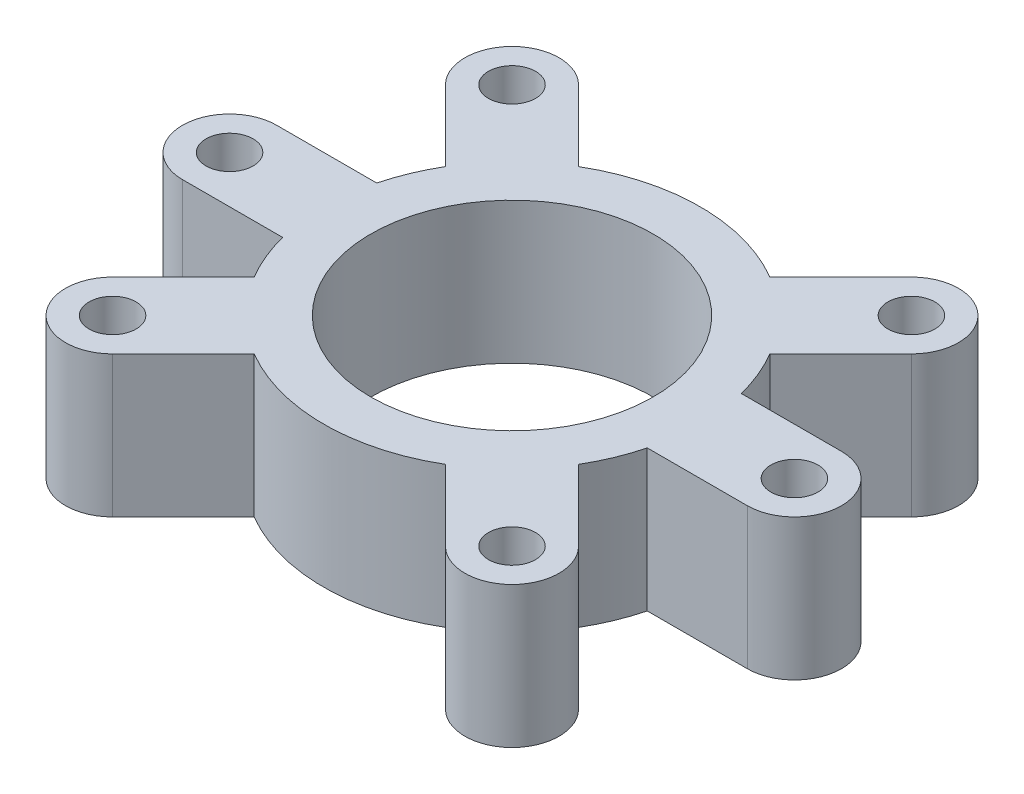
ISO-10303-21;
HEADER;
FILE_DESCRIPTION(('STEP AP214'),'2;1');
FILE_NAME('part.step','',(''),(''),'','','');
FILE_SCHEMA(('AUTOMOTIVE_DESIGN { 1 0 10303 214 1 1 1 1 }'));
ENDSEC;
DATA;
#1=APPLICATION_CONTEXT('core data for automotive mechanical design processes');
#2=APPLICATION_PROTOCOL_DEFINITION('international standard','automotive_design',2000,#1);
#3=PRODUCT_CONTEXT('',#1,'mechanical');
#4=PRODUCT('Part','Part','',(#3));
#5=PRODUCT_RELATED_PRODUCT_CATEGORY('part','',(#4));
#6=PRODUCT_DEFINITION_FORMATION('','',#4);
#7=PRODUCT_DEFINITION_CONTEXT('part definition',#1,'design');
#8=PRODUCT_DEFINITION('design','',#6,#7);
#9=PRODUCT_DEFINITION_SHAPE('','',#8);
#10=(LENGTH_UNIT() NAMED_UNIT(*) SI_UNIT(.MILLI.,.METRE.));
#11=(NAMED_UNIT(*) PLANE_ANGLE_UNIT() SI_UNIT($,.RADIAN.));
#12=(NAMED_UNIT(*) SI_UNIT($,.STERADIAN.) SOLID_ANGLE_UNIT());
#13=UNCERTAINTY_MEASURE_WITH_UNIT(LENGTH_MEASURE(1.E-05),#10,'distance_accuracy_value','');
#14=(GEOMETRIC_REPRESENTATION_CONTEXT(3) GLOBAL_UNCERTAINTY_ASSIGNED_CONTEXT((#13)) GLOBAL_UNIT_ASSIGNED_CONTEXT((#10,
#11,#12)) REPRESENTATION_CONTEXT('',''));
#15=CARTESIAN_POINT('',(0.,0.,0.));
#16=DIRECTION('',(0.,0.,1.));
#17=DIRECTION('',(1.,0.,0.));
#18=AXIS2_PLACEMENT_3D('',#15,#16,#17);
#19=CARTESIAN_POINT('',(0.,15.,0.));
#20=DIRECTION('',(0.,1.,0.));
#21=DIRECTION('',(0.,0.,1.));
#22=AXIS2_PLACEMENT_3D('',#19,#20,#21);
#23=PLANE('',#22);
#24=CARTESIAN_POINT('',(-42.4264068711925,15.,-42.4264068711932));
#25=DIRECTION('',(0.,1.,0.));
#26=DIRECTION('',(0.,0.,1.));
#27=AXIS2_PLACEMENT_3D('',#24,#25,#26);
#28=CIRCLE('',#27,5.);
#29=CARTESIAN_POINT('',(-42.4264068711925,15.,-37.4264068711932));
#30=VERTEX_POINT('',#29);
#31=EDGE_CURVE('E459',#30,#30,#28,.T.);
#32=ORIENTED_EDGE('',*,*,#31,.F.);
#33=EDGE_LOOP('',(#32));
#34=FACE_BOUND('',#33,.T.);
#35=CARTESIAN_POINT('',(-42.4264068711931,15.,42.4264068711926));
#36=DIRECTION('',(0.,1.,0.));
#37=DIRECTION('',(0.,0.,1.));
#38=AXIS2_PLACEMENT_3D('',#35,#36,#37);
#39=CIRCLE('',#38,5.00000000000001);
#40=CARTESIAN_POINT('',(-42.4264068711931,15.,47.4264068711926));
#41=VERTEX_POINT('',#40);
#42=EDGE_CURVE('E471',#41,#41,#39,.T.);
#43=ORIENTED_EDGE('',*,*,#42,.F.);
#44=EDGE_LOOP('',(#43));
#45=FACE_BOUND('',#44,.T.);
#46=CARTESIAN_POINT('',(60.,15.,0.));
#47=DIRECTION('',(0.,1.,0.));
#48=DIRECTION('',(0.,0.,1.));
#49=AXIS2_PLACEMENT_3D('',#46,#47,#48);
#50=CIRCLE('',#49,5.);
#51=CARTESIAN_POINT('',(60.,15.,5.));
#52=VERTEX_POINT('',#51);
#53=EDGE_CURVE('E483',#52,#52,#50,.T.);
#54=ORIENTED_EDGE('',*,*,#53,.F.);
#55=EDGE_LOOP('',(#54));
#56=FACE_BOUND('',#55,.T.);
#57=CARTESIAN_POINT('',(0.,15.,0.));
#58=DIRECTION('',(0.,1.,0.));
#59=DIRECTION('',(0.,0.,1.));
#60=AXIS2_PLACEMENT_3D('',#57,#58,#59);
#61=CIRCLE('',#60,40.);
#62=CARTESIAN_POINT('',(34.4571956871238,15.,20.3150600633929));
#63=VERTEX_POINT('',#62);
#64=CARTESIAN_POINT('',(38.7298334620742,15.,10.));
#65=VERTEX_POINT('',#64);
#66=EDGE_CURVE('E273',#63,#65,#61,.T.);
#67=ORIENTED_EDGE('',*,*,#66,.T.);
#68=DIRECTION('',(1.,0.,0.));
#69=VECTOR('',#68,1.);
#70=CARTESIAN_POINT('',(60.,15.,10.));
#71=LINE('',#70,#69);
#72=CARTESIAN_POINT('',(60.,15.,10.));
#73=VERTEX_POINT('',#72);
#74=EDGE_CURVE('E141',#65,#73,#71,.T.);
#75=ORIENTED_EDGE('',*,*,#74,.T.);
#76=CARTESIAN_POINT('',(60.,15.,0.));
#77=DIRECTION('',(0.,1.,0.));
#78=DIRECTION('',(0.,0.,-1.));
#79=AXIS2_PLACEMENT_3D('',#76,#77,#78);
#80=CIRCLE('',#79,10.);
#81=CARTESIAN_POINT('',(60.,15.,-10.));
#82=VERTEX_POINT('',#81);
#83=EDGE_CURVE('E336',#73,#82,#80,.T.);
#84=ORIENTED_EDGE('',*,*,#83,.T.);
#85=DIRECTION('',(-1.,0.,0.));
#86=VECTOR('',#85,1.);
#87=CARTESIAN_POINT('',(38.7298334620742,15.,-10.));
#88=LINE('',#87,#86);
#89=CARTESIAN_POINT('',(38.7298334620742,15.,-10.));
#90=VERTEX_POINT('',#89);
#91=EDGE_CURVE('E355',#82,#90,#88,.T.);
#92=ORIENTED_EDGE('',*,*,#91,.T.);
#93=CARTESIAN_POINT('',(0.,15.,0.));
#94=DIRECTION('',(0.,1.,0.));
#95=DIRECTION('',(0.,0.,1.));
#96=AXIS2_PLACEMENT_3D('',#93,#94,#95);
#97=CIRCLE('',#96,40.);
#98=CARTESIAN_POINT('',(34.457195687124,15.,-20.3150600633924));
#99=VERTEX_POINT('',#98);
#100=EDGE_CURVE('E352',#90,#99,#97,.T.);
#101=ORIENTED_EDGE('',*,*,#100,.T.);
#102=DIRECTION('',(0.707106781186556,0.,-0.707106781186539));
#103=VECTOR('',#102,1.);
#104=CARTESIAN_POINT('',(49.4974746830587,15.,-35.3553390593268));
#105=LINE('',#104,#103);
#106=CARTESIAN_POINT('',(49.4974746830587,15.,-35.3553390593268));
#107=VERTEX_POINT('',#106);
#108=EDGE_CURVE('E354',#99,#107,#105,.T.);
#109=ORIENTED_EDGE('',*,*,#108,.T.);
#110=CARTESIAN_POINT('',(42.4264068711934,15.,-42.4264068711923));
#111=DIRECTION('',(0.,1.,0.));
#112=DIRECTION('',(0.,0.,-1.));
#113=AXIS2_PLACEMENT_3D('',#110,#111,#112);
#114=CIRCLE('',#113,10.);
#115=CARTESIAN_POINT('',(35.355339059328,15.,-49.4974746830579));
#116=VERTEX_POINT('',#115);
#117=EDGE_CURVE('E357',#107,#116,#114,.T.);
#118=ORIENTED_EDGE('',*,*,#117,.T.);
#119=DIRECTION('',(-0.707106781186556,0.,0.707106781186539));
#120=VECTOR('',#119,1.);
#121=CARTESIAN_POINT('',(20.3150600633932,15.,-34.4571956871235));
#122=LINE('',#121,#120);
#123=CARTESIAN_POINT('',(20.3150600633932,15.,-34.4571956871235));
#124=VERTEX_POINT('',#123);
#125=EDGE_CURVE('E363',#116,#124,#122,.T.);
#126=ORIENTED_EDGE('',*,*,#125,.T.);
#127=CARTESIAN_POINT('',(0.,15.,0.));
#128=DIRECTION('',(0.,1.,0.));
#129=DIRECTION('',(0.,0.,1.));
#130=AXIS2_PLACEMENT_3D('',#127,#128,#129);
#131=CIRCLE('',#130,40.);
#132=CARTESIAN_POINT('',(-20.3150600633925,15.,-34.457195687124));
#133=VERTEX_POINT('',#132);
#134=EDGE_CURVE('E365',#124,#133,#131,.T.);
#135=ORIENTED_EDGE('',*,*,#134,.T.);
#136=DIRECTION('',(-0.707106781186541,0.,-0.707106781186554));
#137=VECTOR('',#136,1.);
#138=CARTESIAN_POINT('',(-35.3553390593269,15.,-49.4974746830586));
#139=LINE('',#138,#137);
#140=CARTESIAN_POINT('',(-35.3553390593269,15.,-49.4974746830586));
#141=VERTEX_POINT('',#140);
#142=EDGE_CURVE('E367',#133,#141,#139,.T.);
#143=ORIENTED_EDGE('',*,*,#142,.T.);
#144=CARTESIAN_POINT('',(-42.4264068711925,15.,-42.4264068711932));
#145=DIRECTION('',(0.,1.,0.));
#146=DIRECTION('',(0.,0.,-1.));
#147=AXIS2_PLACEMENT_3D('',#144,#145,#146);
#148=CIRCLE('',#147,10.);
#149=CARTESIAN_POINT('',(-49.497474683058,15.,-35.3553390593278));
#150=VERTEX_POINT('',#149);
#151=EDGE_CURVE('E369',#141,#150,#148,.T.);
#152=ORIENTED_EDGE('',*,*,#151,.T.);
#153=DIRECTION('',(0.707106781186541,0.,0.707106781186554));
#154=VECTOR('',#153,1.);
#155=CARTESIAN_POINT('',(-34.4571956871236,15.,-20.3150600633931));
#156=LINE('',#155,#154);
#157=CARTESIAN_POINT('',(-34.4571956871236,15.,-20.3150600633931));
#158=VERTEX_POINT('',#157);
#159=EDGE_CURVE('E371',#150,#158,#156,.T.);
#160=ORIENTED_EDGE('',*,*,#159,.T.);
#161=CARTESIAN_POINT('',(0.,15.,0.));
#162=DIRECTION('',(0.,1.,0.));
#163=DIRECTION('',(0.,0.,1.));
#164=AXIS2_PLACEMENT_3D('',#161,#162,#163);
#165=CIRCLE('',#164,40.);
#166=CARTESIAN_POINT('',(-38.7298334620741,15.,-10.0000000000003));
#167=VERTEX_POINT('',#166);
#168=EDGE_CURVE('E373',#158,#167,#165,.T.);
#169=ORIENTED_EDGE('',*,*,#168,.T.);
#170=DIRECTION('',(-1.,0.,0.));
#171=VECTOR('',#170,1.);
#172=CARTESIAN_POINT('',(-59.9999999999999,15.,-10.0000000000004));
#173=LINE('',#172,#171);
#174=CARTESIAN_POINT('',(-59.9999999999999,15.,-10.0000000000004));
#175=VERTEX_POINT('',#174);
#176=EDGE_CURVE('E375',#167,#175,#173,.T.);
#177=ORIENTED_EDGE('',*,*,#176,.T.);
#178=CARTESIAN_POINT('',(-60.,15.,-4.11629879866292E-13));
#179=DIRECTION('',(0.,1.,0.));
#180=DIRECTION('',(0.,0.,-1.));
#181=AXIS2_PLACEMENT_3D('',#178,#179,#180);
#182=CIRCLE('',#181,10.);
#183=CARTESIAN_POINT('',(-60.0000000000001,15.,9.99999999999959));
#184=VERTEX_POINT('',#183);
#185=EDGE_CURVE('E377',#175,#184,#182,.T.);
#186=ORIENTED_EDGE('',*,*,#185,.T.);
#187=DIRECTION('',(1.,0.,0.));
#188=VECTOR('',#187,1.);
#189=CARTESIAN_POINT('',(-38.7298334620742,15.,9.99999999999974));
#190=LINE('',#189,#188);
#191=CARTESIAN_POINT('',(-38.7298334620742,15.,9.99999999999974));
#192=VERTEX_POINT('',#191);
#193=EDGE_CURVE('E379',#184,#192,#190,.T.);
#194=ORIENTED_EDGE('',*,*,#193,.T.);
#195=CARTESIAN_POINT('',(0.,15.,0.));
#196=DIRECTION('',(0.,1.,0.));
#197=DIRECTION('',(0.,0.,1.));
#198=AXIS2_PLACEMENT_3D('',#195,#196,#197);
#199=CIRCLE('',#198,40.);
#200=CARTESIAN_POINT('',(-34.4571956871239,15.,20.3150600633926));
#201=VERTEX_POINT('',#200);
#202=EDGE_CURVE('E381',#192,#201,#199,.T.);
#203=ORIENTED_EDGE('',*,*,#202,.T.);
#204=DIRECTION('',(-0.707106781186551,0.,0.707106781186544));
#205=VECTOR('',#204,1.);
#206=CARTESIAN_POINT('',(-49.4974746830585,15.,35.3553390593271));
#207=LINE('',#206,#205);
#208=CARTESIAN_POINT('',(-49.4974746830585,15.,35.3553390593271));
#209=VERTEX_POINT('',#208);
#210=EDGE_CURVE('E383',#201,#209,#207,.T.);
#211=ORIENTED_EDGE('',*,*,#210,.T.);
#212=CARTESIAN_POINT('',(-42.4264068711931,15.,42.4264068711926));
#213=DIRECTION('',(0.,1.,0.));
#214=DIRECTION('',(0.,0.,-1.));
#215=AXIS2_PLACEMENT_3D('',#212,#213,#214);
#216=CIRCLE('',#215,10.);
#217=CARTESIAN_POINT('',(-35.3553390593276,15.,49.4974746830581));
#218=VERTEX_POINT('',#217);
#219=EDGE_CURVE('E385',#209,#218,#216,.T.);
#220=ORIENTED_EDGE('',*,*,#219,.T.);
#221=DIRECTION('',(0.707106781186551,0.,-0.707106781186544));
#222=VECTOR('',#221,1.);
#223=CARTESIAN_POINT('',(-20.315060063393,15.,34.4571956871237));
#224=LINE('',#223,#222);
#225=CARTESIAN_POINT('',(-20.315060063393,15.,34.4571956871237));
#226=VERTEX_POINT('',#225);
#227=EDGE_CURVE('E387',#218,#226,#224,.T.);
#228=ORIENTED_EDGE('',*,*,#227,.T.);
#229=CARTESIAN_POINT('',(0.,15.,0.));
#230=DIRECTION('',(0.,1.,0.));
#231=DIRECTION('',(0.,0.,1.));
#232=AXIS2_PLACEMENT_3D('',#229,#230,#231);
#233=CIRCLE('',#232,40.);
#234=CARTESIAN_POINT('',(20.3150600633928,15.,34.4571956871238));
#235=VERTEX_POINT('',#234);
#236=EDGE_CURVE('E208',#226,#235,#233,.T.);
#237=ORIENTED_EDGE('',*,*,#236,.T.);
#238=DIRECTION('',(0.707106781186547,0.,0.707106781186548));
#239=VECTOR('',#238,1.);
#240=CARTESIAN_POINT('',(35.3553390593273,15.,49.4974746830584));
#241=LINE('',#240,#239);
#242=CARTESIAN_POINT('',(35.3553390593273,15.,49.4974746830584));
#243=VERTEX_POINT('',#242);
#244=EDGE_CURVE('E202',#235,#243,#241,.T.);
#245=ORIENTED_EDGE('',*,*,#244,.T.);
#246=CARTESIAN_POINT('',(42.4264068711928,15.,42.4264068711929));
#247=DIRECTION('',(0.,1.,0.));
#248=DIRECTION('',(0.,0.,-1.));
#249=AXIS2_PLACEMENT_3D('',#246,#247,#248);
#250=CIRCLE('',#249,10.);
#251=CARTESIAN_POINT('',(49.4974746830583,15.,35.3553390593275));
#252=VERTEX_POINT('',#251);
#253=EDGE_CURVE('E206',#243,#252,#250,.T.);
#254=ORIENTED_EDGE('',*,*,#253,.T.);
#255=DIRECTION('',(-0.707106781186546,0.,-0.707106781186549));
#256=VECTOR('',#255,1.);
#257=CARTESIAN_POINT('',(34.4571956871238,15.,20.3150600633929));
#258=LINE('',#257,#256);
#259=EDGE_CURVE('E50',#252,#63,#258,.T.);
#260=ORIENTED_EDGE('',*,*,#259,.T.);
#261=EDGE_LOOP('',(#67,#75,#84,#92,#101,#109,#118,#126,#135,#143,#152,#160,#169,#177,#186,#194,
#203,#211,#220,#228,#237,#245,#254,#260));
#262=FACE_BOUND('',#261,.T.);
#263=CARTESIAN_POINT('',(0.,15.,0.));
#264=DIRECTION('',(0.,1.,0.));
#265=DIRECTION('',(0.,0.,1.));
#266=AXIS2_PLACEMENT_3D('',#263,#264,#265);
#267=CIRCLE('',#266,30.);
#268=CARTESIAN_POINT('',(0.,15.,30.));
#269=VERTEX_POINT('',#268);
#270=EDGE_CURVE('E230',#269,#269,#267,.T.);
#271=ORIENTED_EDGE('',*,*,#270,.F.);
#272=EDGE_LOOP('',(#271));
#273=FACE_BOUND('',#272,.T.);
#274=CARTESIAN_POINT('',(42.4264068711928,15.,42.4264068711929));
#275=DIRECTION('',(0.,1.,0.));
#276=DIRECTION('',(0.,0.,1.));
#277=AXIS2_PLACEMENT_3D('',#274,#275,#276);
#278=CIRCLE('',#277,5.00000000000001);
#279=CARTESIAN_POINT('',(42.4264068711928,15.,47.4264068711929));
#280=VERTEX_POINT('',#279);
#281=EDGE_CURVE('E477',#280,#280,#278,.T.);
#282=ORIENTED_EDGE('',*,*,#281,.F.);
#283=EDGE_LOOP('',(#282));
#284=FACE_BOUND('',#283,.T.);
#285=CARTESIAN_POINT('',(-60.,15.,-4.11629879866292E-13));
#286=DIRECTION('',(0.,1.,0.));
#287=DIRECTION('',(0.,0.,1.));
#288=AXIS2_PLACEMENT_3D('',#285,#286,#287);
#289=CIRCLE('',#288,5.00000000000001);
#290=CARTESIAN_POINT('',(-60.,15.,4.9999999999996));
#291=VERTEX_POINT('',#290);
#292=EDGE_CURVE('E465',#291,#291,#289,.T.);
#293=ORIENTED_EDGE('',*,*,#292,.F.);
#294=EDGE_LOOP('',(#293));
#295=FACE_BOUND('',#294,.T.);
#296=CARTESIAN_POINT('',(42.4264068711934,15.,-42.4264068711923));
#297=DIRECTION('',(0.,1.,0.));
#298=DIRECTION('',(0.,0.,1.));
#299=AXIS2_PLACEMENT_3D('',#296,#297,#298);
#300=CIRCLE('',#299,5.00000000000001);
#301=CARTESIAN_POINT('',(42.4264068711934,15.,-37.4264068711923));
#302=VERTEX_POINT('',#301);
#303=EDGE_CURVE('E450',#302,#302,#300,.T.);
#304=ORIENTED_EDGE('',*,*,#303,.F.);
#305=EDGE_LOOP('',(#304));
#306=FACE_BOUND('',#305,.T.);
#307=ADVANCED_FACE('F33',(#34,#45,#56,#262,#273,#284,#295,#306),#23,.T.);
#308=CARTESIAN_POINT('',(0.,-15.,0.));
#309=DIRECTION('',(0.,1.,0.));
#310=DIRECTION('',(0.,0.,1.));
#311=AXIS2_PLACEMENT_3D('',#308,#309,#310);
#312=PLANE('',#311);
#313=CARTESIAN_POINT('',(0.,-15.,0.));
#314=DIRECTION('',(0.,1.,0.));
#315=DIRECTION('',(0.,0.,1.));
#316=AXIS2_PLACEMENT_3D('',#313,#314,#315);
#317=CIRCLE('',#316,40.);
#318=CARTESIAN_POINT('',(34.4571956871238,-15.,20.3150600633929));
#319=VERTEX_POINT('',#318);
#320=CARTESIAN_POINT('',(38.7298334620742,-15.,10.));
#321=VERTEX_POINT('',#320);
#322=EDGE_CURVE('E226',#319,#321,#317,.T.);
#323=ORIENTED_EDGE('',*,*,#322,.F.);
#324=DIRECTION('',(-0.707106781186546,0.,-0.707106781186549));
#325=VECTOR('',#324,1.);
#326=CARTESIAN_POINT('',(34.4571956871238,-15.,20.3150600633929));
#327=LINE('',#326,#325);
#328=CARTESIAN_POINT('',(49.4974746830583,-15.,35.3553390593275));
#329=VERTEX_POINT('',#328);
#330=EDGE_CURVE('E133',#329,#319,#327,.T.);
#331=ORIENTED_EDGE('',*,*,#330,.F.);
#332=CARTESIAN_POINT('',(42.4264068711928,-15.,42.4264068711929));
#333=DIRECTION('',(0.,1.,0.));
#334=DIRECTION('',(0.,0.,-1.));
#335=AXIS2_PLACEMENT_3D('',#332,#333,#334);
#336=CIRCLE('',#335,10.);
#337=CARTESIAN_POINT('',(35.3553390593273,-15.,49.4974746830584));
#338=VERTEX_POINT('',#337);
#339=EDGE_CURVE('E127',#338,#329,#336,.T.);
#340=ORIENTED_EDGE('',*,*,#339,.F.);
#341=DIRECTION('',(0.707106781186547,0.,0.707106781186548));
#342=VECTOR('',#341,1.);
#343=CARTESIAN_POINT('',(35.3553390593273,-15.,49.4974746830584));
#344=LINE('',#343,#342);
#345=CARTESIAN_POINT('',(20.3150600633928,-15.,34.4571956871238));
#346=VERTEX_POINT('',#345);
#347=EDGE_CURVE('E216',#346,#338,#344,.T.);
#348=ORIENTED_EDGE('',*,*,#347,.F.);
#349=CARTESIAN_POINT('',(0.,-15.,0.));
#350=DIRECTION('',(0.,1.,0.));
#351=DIRECTION('',(0.,0.,1.));
#352=AXIS2_PLACEMENT_3D('',#349,#350,#351);
#353=CIRCLE('',#352,40.);
#354=CARTESIAN_POINT('',(-20.315060063393,-15.,34.4571956871237));
#355=VERTEX_POINT('',#354);
#356=EDGE_CURVE('E268',#355,#346,#353,.T.);
#357=ORIENTED_EDGE('',*,*,#356,.F.);
#358=DIRECTION('',(0.707106781186551,0.,-0.707106781186544));
#359=VECTOR('',#358,1.);
#360=CARTESIAN_POINT('',(-20.315060063393,-15.,34.4571956871237));
#361=LINE('',#360,#359);
#362=CARTESIAN_POINT('',(-35.3553390593276,-15.,49.4974746830581));
#363=VERTEX_POINT('',#362);
#364=EDGE_CURVE('E266',#363,#355,#361,.T.);
#365=ORIENTED_EDGE('',*,*,#364,.F.);
#366=CARTESIAN_POINT('',(-42.4264068711931,-15.,42.4264068711926));
#367=DIRECTION('',(0.,1.,0.));
#368=DIRECTION('',(0.,0.,-1.));
#369=AXIS2_PLACEMENT_3D('',#366,#367,#368);
#370=CIRCLE('',#369,10.);
#371=CARTESIAN_POINT('',(-49.4974746830585,-15.,35.3553390593271));
#372=VERTEX_POINT('',#371);
#373=EDGE_CURVE('E264',#372,#363,#370,.T.);
#374=ORIENTED_EDGE('',*,*,#373,.F.);
#375=DIRECTION('',(-0.707106781186551,0.,0.707106781186544));
#376=VECTOR('',#375,1.);
#377=CARTESIAN_POINT('',(-49.4974746830585,-15.,35.3553390593271));
#378=LINE('',#377,#376);
#379=CARTESIAN_POINT('',(-34.4571956871239,-15.,20.3150600633926));
#380=VERTEX_POINT('',#379);
#381=EDGE_CURVE('E262',#380,#372,#378,.T.);
#382=ORIENTED_EDGE('',*,*,#381,.F.);
#383=CARTESIAN_POINT('',(0.,-15.,0.));
#384=DIRECTION('',(0.,1.,0.));
#385=DIRECTION('',(0.,0.,1.));
#386=AXIS2_PLACEMENT_3D('',#383,#384,#385);
#387=CIRCLE('',#386,40.);
#388=CARTESIAN_POINT('',(-38.7298334620742,-15.,9.99999999999974));
#389=VERTEX_POINT('',#388);
#390=EDGE_CURVE('E260',#389,#380,#387,.T.);
#391=ORIENTED_EDGE('',*,*,#390,.F.);
#392=DIRECTION('',(1.,0.,0.));
#393=VECTOR('',#392,1.);
#394=CARTESIAN_POINT('',(-38.7298334620742,-15.,9.99999999999974));
#395=LINE('',#394,#393);
#396=CARTESIAN_POINT('',(-60.0000000000001,-15.,9.99999999999959));
#397=VERTEX_POINT('',#396);
#398=EDGE_CURVE('E258',#397,#389,#395,.T.);
#399=ORIENTED_EDGE('',*,*,#398,.F.);
#400=CARTESIAN_POINT('',(-60.,-15.,-4.11629879866292E-13));
#401=DIRECTION('',(0.,1.,0.));
#402=DIRECTION('',(0.,0.,-1.));
#403=AXIS2_PLACEMENT_3D('',#400,#401,#402);
#404=CIRCLE('',#403,10.);
#405=CARTESIAN_POINT('',(-59.9999999999999,-15.,-10.0000000000004));
#406=VERTEX_POINT('',#405);
#407=EDGE_CURVE('E256',#406,#397,#404,.T.);
#408=ORIENTED_EDGE('',*,*,#407,.F.);
#409=DIRECTION('',(-1.,0.,0.));
#410=VECTOR('',#409,1.);
#411=CARTESIAN_POINT('',(-59.9999999999999,-15.,-10.0000000000004));
#412=LINE('',#411,#410);
#413=CARTESIAN_POINT('',(-38.7298334620741,-15.,-10.0000000000003));
#414=VERTEX_POINT('',#413);
#415=EDGE_CURVE('E254',#414,#406,#412,.T.);
#416=ORIENTED_EDGE('',*,*,#415,.F.);
#417=CARTESIAN_POINT('',(0.,-15.,0.));
#418=DIRECTION('',(0.,1.,0.));
#419=DIRECTION('',(0.,0.,1.));
#420=AXIS2_PLACEMENT_3D('',#417,#418,#419);
#421=CIRCLE('',#420,40.);
#422=CARTESIAN_POINT('',(-34.4571956871236,-15.,-20.3150600633931));
#423=VERTEX_POINT('',#422);
#424=EDGE_CURVE('E252',#423,#414,#421,.T.);
#425=ORIENTED_EDGE('',*,*,#424,.F.);
#426=DIRECTION('',(0.707106781186541,0.,0.707106781186554));
#427=VECTOR('',#426,1.);
#428=CARTESIAN_POINT('',(-34.4571956871236,-15.,-20.3150600633931));
#429=LINE('',#428,#427);
#430=CARTESIAN_POINT('',(-49.497474683058,-15.,-35.3553390593278));
#431=VERTEX_POINT('',#430);
#432=EDGE_CURVE('E250',#431,#423,#429,.T.);
#433=ORIENTED_EDGE('',*,*,#432,.F.);
#434=CARTESIAN_POINT('',(-42.4264068711925,-15.,-42.4264068711932));
#435=DIRECTION('',(0.,1.,0.));
#436=DIRECTION('',(0.,0.,-1.));
#437=AXIS2_PLACEMENT_3D('',#434,#435,#436);
#438=CIRCLE('',#437,10.);
#439=CARTESIAN_POINT('',(-35.3553390593269,-15.,-49.4974746830586));
#440=VERTEX_POINT('',#439);
#441=EDGE_CURVE('E248',#440,#431,#438,.T.);
#442=ORIENTED_EDGE('',*,*,#441,.F.);
#443=DIRECTION('',(-0.707106781186541,0.,-0.707106781186554));
#444=VECTOR('',#443,1.);
#445=CARTESIAN_POINT('',(-35.3553390593269,-15.,-49.4974746830586));
#446=LINE('',#445,#444);
#447=CARTESIAN_POINT('',(-20.3150600633925,-15.,-34.457195687124));
#448=VERTEX_POINT('',#447);
#449=EDGE_CURVE('E246',#448,#440,#446,.T.);
#450=ORIENTED_EDGE('',*,*,#449,.F.);
#451=CARTESIAN_POINT('',(0.,-15.,0.));
#452=DIRECTION('',(0.,1.,0.));
#453=DIRECTION('',(0.,0.,1.));
#454=AXIS2_PLACEMENT_3D('',#451,#452,#453);
#455=CIRCLE('',#454,40.);
#456=CARTESIAN_POINT('',(20.3150600633932,-15.,-34.4571956871235));
#457=VERTEX_POINT('',#456);
#458=EDGE_CURVE('E244',#457,#448,#455,.T.);
#459=ORIENTED_EDGE('',*,*,#458,.F.);
#460=DIRECTION('',(-0.707106781186556,0.,0.707106781186539));
#461=VECTOR('',#460,1.);
#462=CARTESIAN_POINT('',(20.3150600633932,-15.,-34.4571956871235));
#463=LINE('',#462,#461);
#464=CARTESIAN_POINT('',(35.355339059328,-15.,-49.4974746830579));
#465=VERTEX_POINT('',#464);
#466=EDGE_CURVE('E242',#465,#457,#463,.T.);
#467=ORIENTED_EDGE('',*,*,#466,.F.);
#468=CARTESIAN_POINT('',(42.4264068711934,-15.,-42.4264068711923));
#469=DIRECTION('',(0.,1.,0.));
#470=DIRECTION('',(0.,0.,-1.));
#471=AXIS2_PLACEMENT_3D('',#468,#469,#470);
#472=CIRCLE('',#471,10.);
#473=CARTESIAN_POINT('',(49.4974746830587,-15.,-35.3553390593268));
#474=VERTEX_POINT('',#473);
#475=EDGE_CURVE('E240',#474,#465,#472,.T.);
#476=ORIENTED_EDGE('',*,*,#475,.F.);
#477=DIRECTION('',(0.707106781186556,0.,-0.707106781186539));
#478=VECTOR('',#477,1.);
#479=CARTESIAN_POINT('',(49.4974746830587,-15.,-35.3553390593268));
#480=LINE('',#479,#478);
#481=CARTESIAN_POINT('',(34.457195687124,-15.,-20.3150600633924));
#482=VERTEX_POINT('',#481);
#483=EDGE_CURVE('E238',#482,#474,#480,.T.);
#484=ORIENTED_EDGE('',*,*,#483,.F.);
#485=CARTESIAN_POINT('',(0.,-15.,0.));
#486=DIRECTION('',(0.,1.,0.));
#487=DIRECTION('',(0.,0.,1.));
#488=AXIS2_PLACEMENT_3D('',#485,#486,#487);
#489=CIRCLE('',#488,40.);
#490=CARTESIAN_POINT('',(38.7298334620742,-15.,-10.));
#491=VERTEX_POINT('',#490);
#492=EDGE_CURVE('E236',#491,#482,#489,.T.);
#493=ORIENTED_EDGE('',*,*,#492,.F.);
#494=DIRECTION('',(-1.,0.,0.));
#495=VECTOR('',#494,1.);
#496=CARTESIAN_POINT('',(38.7298334620742,-15.,-10.));
#497=LINE('',#496,#495);
#498=CARTESIAN_POINT('',(60.,-15.,-10.));
#499=VERTEX_POINT('',#498);
#500=EDGE_CURVE('E234',#499,#491,#497,.T.);
#501=ORIENTED_EDGE('',*,*,#500,.F.);
#502=CARTESIAN_POINT('',(60.,-15.,0.));
#503=DIRECTION('',(0.,1.,0.));
#504=DIRECTION('',(0.,0.,-1.));
#505=AXIS2_PLACEMENT_3D('',#502,#503,#504);
#506=CIRCLE('',#505,10.);
#507=CARTESIAN_POINT('',(60.,-15.,10.));
#508=VERTEX_POINT('',#507);
#509=EDGE_CURVE('E232',#508,#499,#506,.T.);
#510=ORIENTED_EDGE('',*,*,#509,.F.);
#511=DIRECTION('',(1.,0.,0.));
#512=VECTOR('',#511,1.);
#513=CARTESIAN_POINT('',(60.,-15.,10.));
#514=LINE('',#513,#512);
#515=EDGE_CURVE('E229',#321,#508,#514,.T.);
#516=ORIENTED_EDGE('',*,*,#515,.F.);
#517=EDGE_LOOP('',(#323,#331,#340,#348,#357,#365,#374,#382,#391,#399,#408,#416,#425,#433,#442,
#450,#459,#467,#476,#484,#493,#501,#510,#516));
#518=FACE_BOUND('',#517,.T.);
#519=CARTESIAN_POINT('',(0.,-15.,0.));
#520=DIRECTION('',(0.,1.,0.));
#521=DIRECTION('',(0.,0.,1.));
#522=AXIS2_PLACEMENT_3D('',#519,#520,#521);
#523=CIRCLE('',#522,30.);
#524=CARTESIAN_POINT('',(0.,-15.,30.));
#525=VERTEX_POINT('',#524);
#526=EDGE_CURVE('E486',#525,#525,#523,.T.);
#527=ORIENTED_EDGE('',*,*,#526,.T.);
#528=EDGE_LOOP('',(#527));
#529=FACE_BOUND('',#528,.T.);
#530=CARTESIAN_POINT('',(60.,-15.,0.));
#531=DIRECTION('',(0.,1.,0.));
#532=DIRECTION('',(0.,0.,1.));
#533=AXIS2_PLACEMENT_3D('',#530,#531,#532);
#534=CIRCLE('',#533,5.);
#535=CARTESIAN_POINT('',(60.,-15.,5.));
#536=VERTEX_POINT('',#535);
#537=EDGE_CURVE('E480',#536,#536,#534,.T.);
#538=ORIENTED_EDGE('',*,*,#537,.T.);
#539=EDGE_LOOP('',(#538));
#540=FACE_BOUND('',#539,.T.);
#541=CARTESIAN_POINT('',(42.4264068711928,-15.,42.4264068711929));
#542=DIRECTION('',(0.,1.,0.));
#543=DIRECTION('',(0.,0.,1.));
#544=AXIS2_PLACEMENT_3D('',#541,#542,#543);
#545=CIRCLE('',#544,5.00000000000001);
#546=CARTESIAN_POINT('',(42.4264068711928,-15.,47.4264068711929));
#547=VERTEX_POINT('',#546);
#548=EDGE_CURVE('E474',#547,#547,#545,.T.);
#549=ORIENTED_EDGE('',*,*,#548,.T.);
#550=EDGE_LOOP('',(#549));
#551=FACE_BOUND('',#550,.T.);
#552=CARTESIAN_POINT('',(-42.4264068711931,-15.,42.4264068711926));
#553=DIRECTION('',(0.,1.,0.));
#554=DIRECTION('',(0.,0.,1.));
#555=AXIS2_PLACEMENT_3D('',#552,#553,#554);
#556=CIRCLE('',#555,5.00000000000001);
#557=CARTESIAN_POINT('',(-42.4264068711931,-15.,47.4264068711926));
#558=VERTEX_POINT('',#557);
#559=EDGE_CURVE('E468',#558,#558,#556,.T.);
#560=ORIENTED_EDGE('',*,*,#559,.T.);
#561=EDGE_LOOP('',(#560));
#562=FACE_BOUND('',#561,.T.);
#563=CARTESIAN_POINT('',(-60.,-15.,-4.11629879866292E-13));
#564=DIRECTION('',(0.,1.,0.));
#565=DIRECTION('',(0.,0.,1.));
#566=AXIS2_PLACEMENT_3D('',#563,#564,#565);
#567=CIRCLE('',#566,5.00000000000001);
#568=CARTESIAN_POINT('',(-60.,-15.,4.9999999999996));
#569=VERTEX_POINT('',#568);
#570=EDGE_CURVE('E462',#569,#569,#567,.T.);
#571=ORIENTED_EDGE('',*,*,#570,.T.);
#572=EDGE_LOOP('',(#571));
#573=FACE_BOUND('',#572,.T.);
#574=CARTESIAN_POINT('',(-42.4264068711925,-15.,-42.4264068711932));
#575=DIRECTION('',(0.,1.,0.));
#576=DIRECTION('',(0.,0.,1.));
#577=AXIS2_PLACEMENT_3D('',#574,#575,#576);
#578=CIRCLE('',#577,5.);
#579=CARTESIAN_POINT('',(-42.4264068711925,-15.,-37.4264068711932));
#580=VERTEX_POINT('',#579);
#581=EDGE_CURVE('E456',#580,#580,#578,.T.);
#582=ORIENTED_EDGE('',*,*,#581,.T.);
#583=EDGE_LOOP('',(#582));
#584=FACE_BOUND('',#583,.T.);
#585=CARTESIAN_POINT('',(42.4264068711934,-15.,-42.4264068711923));
#586=DIRECTION('',(0.,1.,0.));
#587=DIRECTION('',(0.,0.,1.));
#588=AXIS2_PLACEMENT_3D('',#585,#586,#587);
#589=CIRCLE('',#588,5.00000000000001);
#590=CARTESIAN_POINT('',(42.4264068711934,-15.,-37.4264068711923));
#591=VERTEX_POINT('',#590);
#592=EDGE_CURVE('E453',#591,#591,#589,.T.);
#593=ORIENTED_EDGE('',*,*,#592,.T.);
#594=EDGE_LOOP('',(#593));
#595=FACE_BOUND('',#594,.T.);
#596=ADVANCED_FACE('F340',(#518,#529,#540,#551,#562,#573,#584,#595),#312,.F.);
#597=CARTESIAN_POINT('',(0.,15.,0.));
#598=DIRECTION('',(0.,-1.,0.));
#599=DIRECTION('',(0.,0.,-1.));
#600=AXIS2_PLACEMENT_3D('',#597,#598,#599);
#601=CYLINDRICAL_SURFACE('',#600,40.);
#602=ORIENTED_EDGE('',*,*,#322,.T.);
#603=DIRECTION('',(0.,-1.,0.));
#604=VECTOR('',#603,1.);
#605=CARTESIAN_POINT('',(38.7298334620742,15.,10.));
#606=LINE('',#605,#604);
#607=EDGE_CURVE('E11',#65,#321,#606,.T.);
#608=ORIENTED_EDGE('',*,*,#607,.F.);
#609=ORIENTED_EDGE('',*,*,#66,.F.);
#610=DIRECTION('',(0.,-1.,0.));
#611=VECTOR('',#610,1.);
#612=CARTESIAN_POINT('',(34.4571956871238,15.,20.3150600633929));
#613=LINE('',#612,#611);
#614=EDGE_CURVE('E222',#63,#319,#613,.T.);
#615=ORIENTED_EDGE('',*,*,#614,.T.);
#616=EDGE_LOOP('',(#602,#608,#609,#615));
#617=FACE_BOUND('',#616,.T.);
#618=ADVANCED_FACE('F35',(#617),#601,.T.);
#619=CARTESIAN_POINT('',(60.,15.,10.));
#620=DIRECTION('',(0.,0.,-1.));
#621=DIRECTION('',(-1.,0.,0.));
#622=AXIS2_PLACEMENT_3D('',#619,#620,#621);
#623=PLANE('',#622);
#624=ORIENTED_EDGE('',*,*,#515,.T.);
#625=DIRECTION('',(0.,-1.,0.));
#626=VECTOR('',#625,1.);
#627=CARTESIAN_POINT('',(60.,15.,10.));
#628=LINE('',#627,#626);
#629=EDGE_CURVE('E42',#73,#508,#628,.T.);
#630=ORIENTED_EDGE('',*,*,#629,.F.);
#631=ORIENTED_EDGE('',*,*,#74,.F.);
#632=ORIENTED_EDGE('',*,*,#607,.T.);
#633=EDGE_LOOP('',(#624,#630,#631,#632));
#634=FACE_BOUND('',#633,.T.);
#635=ADVANCED_FACE('F743',(#634),#623,.F.);
#636=CARTESIAN_POINT('',(60.,15.,0.));
#637=DIRECTION('',(0.,-1.,0.));
#638=DIRECTION('',(0.,0.,-1.));
#639=AXIS2_PLACEMENT_3D('',#636,#637,#638);
#640=CYLINDRICAL_SURFACE('',#639,10.);
#641=ORIENTED_EDGE('',*,*,#509,.T.);
#642=DIRECTION('',(0.,-1.,0.));
#643=VECTOR('',#642,1.);
#644=CARTESIAN_POINT('',(60.,15.,-10.));
#645=LINE('',#644,#643);
#646=EDGE_CURVE('E328',#82,#499,#645,.T.);
#647=ORIENTED_EDGE('',*,*,#646,.F.);
#648=ORIENTED_EDGE('',*,*,#83,.F.);
#649=ORIENTED_EDGE('',*,*,#629,.T.);
#650=EDGE_LOOP('',(#641,#647,#648,#649));
#651=FACE_BOUND('',#650,.T.);
#652=ADVANCED_FACE('F334',(#651),#640,.T.);
#653=CARTESIAN_POINT('',(38.7298334620742,15.,-10.));
#654=DIRECTION('',(0.,0.,1.));
#655=DIRECTION('',(1.,0.,0.));
#656=AXIS2_PLACEMENT_3D('',#653,#654,#655);
#657=PLANE('',#656);
#658=ORIENTED_EDGE('',*,*,#500,.T.);
#659=DIRECTION('',(0.,-1.,0.));
#660=VECTOR('',#659,1.);
#661=CARTESIAN_POINT('',(38.7298334620742,15.,-10.));
#662=LINE('',#661,#660);
#663=EDGE_CURVE('E325',#90,#491,#662,.T.);
#664=ORIENTED_EDGE('',*,*,#663,.F.);
#665=ORIENTED_EDGE('',*,*,#91,.F.);
#666=ORIENTED_EDGE('',*,*,#646,.T.);
#667=EDGE_LOOP('',(#658,#664,#665,#666));
#668=FACE_BOUND('',#667,.T.);
#669=ADVANCED_FACE('F346',(#668),#657,.F.);
#670=CARTESIAN_POINT('',(0.,15.,0.));
#671=DIRECTION('',(0.,-1.,0.));
#672=DIRECTION('',(0.,0.,-1.));
#673=AXIS2_PLACEMENT_3D('',#670,#671,#672);
#674=CYLINDRICAL_SURFACE('',#673,40.);
#675=ORIENTED_EDGE('',*,*,#492,.T.);
#676=DIRECTION('',(0.,-1.,0.));
#677=VECTOR('',#676,1.);
#678=CARTESIAN_POINT('',(34.457195687124,15.,-20.3150600633924));
#679=LINE('',#678,#677);
#680=EDGE_CURVE('E322',#99,#482,#679,.T.);
#681=ORIENTED_EDGE('',*,*,#680,.F.);
#682=ORIENTED_EDGE('',*,*,#100,.F.);
#683=ORIENTED_EDGE('',*,*,#663,.T.);
#684=EDGE_LOOP('',(#675,#681,#682,#683));
#685=FACE_BOUND('',#684,.T.);
#686=ADVANCED_FACE('F350',(#685),#674,.T.);
#687=CARTESIAN_POINT('',(49.4974746830587,15.,-35.3553390593268));
#688=DIRECTION('',(-0.707106781186539,0.,-0.707106781186556));
#689=DIRECTION('',(-0.707106781186556,0.,0.707106781186539));
#690=AXIS2_PLACEMENT_3D('',#687,#688,#689);
#691=PLANE('',#690);
#692=ORIENTED_EDGE('',*,*,#483,.T.);
#693=DIRECTION('',(0.,-1.,0.));
#694=VECTOR('',#693,1.);
#695=CARTESIAN_POINT('',(49.4974746830587,15.,-35.3553390593268));
#696=LINE('',#695,#694);
#697=EDGE_CURVE('E319',#107,#474,#696,.T.);
#698=ORIENTED_EDGE('',*,*,#697,.F.);
#699=ORIENTED_EDGE('',*,*,#108,.F.);
#700=ORIENTED_EDGE('',*,*,#680,.T.);
#701=EDGE_LOOP('',(#692,#698,#699,#700));
#702=FACE_BOUND('',#701,.T.);
#703=ADVANCED_FACE('F708',(#702),#691,.F.);
#704=CARTESIAN_POINT('',(42.4264068711934,15.,-42.4264068711923));
#705=DIRECTION('',(0.,-1.,0.));
#706=DIRECTION('',(0.,0.,-1.));
#707=AXIS2_PLACEMENT_3D('',#704,#705,#706);
#708=CYLINDRICAL_SURFACE('',#707,10.);
#709=ORIENTED_EDGE('',*,*,#475,.T.);
#710=DIRECTION('',(0.,-1.,0.));
#711=VECTOR('',#710,1.);
#712=CARTESIAN_POINT('',(35.355339059328,15.,-49.4974746830579));
#713=LINE('',#712,#711);
#714=EDGE_CURVE('E316',#116,#465,#713,.T.);
#715=ORIENTED_EDGE('',*,*,#714,.F.);
#716=ORIENTED_EDGE('',*,*,#117,.F.);
#717=ORIENTED_EDGE('',*,*,#697,.T.);
#718=EDGE_LOOP('',(#709,#715,#716,#717));
#719=FACE_BOUND('',#718,.T.);
#720=ADVANCED_FACE('F698',(#719),#708,.T.);
#721=CARTESIAN_POINT('',(20.3150600633932,15.,-34.4571956871235));
#722=DIRECTION('',(0.707106781186539,0.,0.707106781186556));
#723=DIRECTION('',(0.707106781186556,0.,-0.707106781186539));
#724=AXIS2_PLACEMENT_3D('',#721,#722,#723);
#725=PLANE('',#724);
#726=ORIENTED_EDGE('',*,*,#466,.T.);
#727=DIRECTION('',(0.,-1.,0.));
#728=VECTOR('',#727,1.);
#729=CARTESIAN_POINT('',(20.3150600633932,15.,-34.4571956871235));
#730=LINE('',#729,#728);
#731=EDGE_CURVE('E313',#124,#457,#730,.T.);
#732=ORIENTED_EDGE('',*,*,#731,.F.);
#733=ORIENTED_EDGE('',*,*,#125,.F.);
#734=ORIENTED_EDGE('',*,*,#714,.T.);
#735=EDGE_LOOP('',(#726,#732,#733,#734));
#736=FACE_BOUND('',#735,.T.);
#737=ADVANCED_FACE('F688',(#736),#725,.F.);
#738=CARTESIAN_POINT('',(0.,15.,0.));
#739=DIRECTION('',(0.,-1.,0.));
#740=DIRECTION('',(0.,0.,-1.));
#741=AXIS2_PLACEMENT_3D('',#738,#739,#740);
#742=CYLINDRICAL_SURFACE('',#741,40.);
#743=ORIENTED_EDGE('',*,*,#458,.T.);
#744=DIRECTION('',(0.,-1.,0.));
#745=VECTOR('',#744,1.);
#746=CARTESIAN_POINT('',(-20.3150600633925,15.,-34.457195687124));
#747=LINE('',#746,#745);
#748=EDGE_CURVE('E310',#133,#448,#747,.T.);
#749=ORIENTED_EDGE('',*,*,#748,.F.);
#750=ORIENTED_EDGE('',*,*,#134,.F.);
#751=ORIENTED_EDGE('',*,*,#731,.T.);
#752=EDGE_LOOP('',(#743,#749,#750,#751));
#753=FACE_BOUND('',#752,.T.);
#754=ADVANCED_FACE('F678',(#753),#742,.T.);
#755=CARTESIAN_POINT('',(-35.3553390593269,15.,-49.4974746830586));
#756=DIRECTION('',(-0.707106781186554,0.,0.707106781186541));
#757=DIRECTION('',(0.707106781186541,0.,0.707106781186554));
#758=AXIS2_PLACEMENT_3D('',#755,#756,#757);
#759=PLANE('',#758);
#760=ORIENTED_EDGE('',*,*,#449,.T.);
#761=DIRECTION('',(0.,-1.,0.));
#762=VECTOR('',#761,1.);
#763=CARTESIAN_POINT('',(-35.3553390593269,15.,-49.4974746830586));
#764=LINE('',#763,#762);
#765=EDGE_CURVE('E307',#141,#440,#764,.T.);
#766=ORIENTED_EDGE('',*,*,#765,.F.);
#767=ORIENTED_EDGE('',*,*,#142,.F.);
#768=ORIENTED_EDGE('',*,*,#748,.T.);
#769=EDGE_LOOP('',(#760,#766,#767,#768));
#770=FACE_BOUND('',#769,.T.);
#771=ADVANCED_FACE('F668',(#770),#759,.F.);
#772=CARTESIAN_POINT('',(-42.4264068711925,15.,-42.4264068711932));
#773=DIRECTION('',(0.,-1.,0.));
#774=DIRECTION('',(0.,0.,-1.));
#775=AXIS2_PLACEMENT_3D('',#772,#773,#774);
#776=CYLINDRICAL_SURFACE('',#775,10.);
#777=ORIENTED_EDGE('',*,*,#441,.T.);
#778=DIRECTION('',(0.,-1.,0.));
#779=VECTOR('',#778,1.);
#780=CARTESIAN_POINT('',(-49.497474683058,15.,-35.3553390593278));
#781=LINE('',#780,#779);
#782=EDGE_CURVE('E304',#150,#431,#781,.T.);
#783=ORIENTED_EDGE('',*,*,#782,.F.);
#784=ORIENTED_EDGE('',*,*,#151,.F.);
#785=ORIENTED_EDGE('',*,*,#765,.T.);
#786=EDGE_LOOP('',(#777,#783,#784,#785));
#787=FACE_BOUND('',#786,.T.);
#788=ADVANCED_FACE('F658',(#787),#776,.T.);
#789=CARTESIAN_POINT('',(-34.4571956871236,15.,-20.3150600633931));
#790=DIRECTION('',(0.707106781186554,0.,-0.707106781186541));
#791=DIRECTION('',(-0.707106781186541,0.,-0.707106781186554));
#792=AXIS2_PLACEMENT_3D('',#789,#790,#791);
#793=PLANE('',#792);
#794=ORIENTED_EDGE('',*,*,#432,.T.);
#795=DIRECTION('',(0.,-1.,0.));
#796=VECTOR('',#795,1.);
#797=CARTESIAN_POINT('',(-34.4571956871236,15.,-20.3150600633931));
#798=LINE('',#797,#796);
#799=EDGE_CURVE('E301',#158,#423,#798,.T.);
#800=ORIENTED_EDGE('',*,*,#799,.F.);
#801=ORIENTED_EDGE('',*,*,#159,.F.);
#802=ORIENTED_EDGE('',*,*,#782,.T.);
#803=EDGE_LOOP('',(#794,#800,#801,#802));
#804=FACE_BOUND('',#803,.T.);
#805=ADVANCED_FACE('F648',(#804),#793,.F.);
#806=CARTESIAN_POINT('',(0.,15.,0.));
#807=DIRECTION('',(0.,-1.,0.));
#808=DIRECTION('',(0.,0.,-1.));
#809=AXIS2_PLACEMENT_3D('',#806,#807,#808);
#810=CYLINDRICAL_SURFACE('',#809,40.);
#811=ORIENTED_EDGE('',*,*,#424,.T.);
#812=DIRECTION('',(0.,-1.,0.));
#813=VECTOR('',#812,1.);
#814=CARTESIAN_POINT('',(-38.7298334620741,15.,-10.0000000000003));
#815=LINE('',#814,#813);
#816=EDGE_CURVE('E298',#167,#414,#815,.T.);
#817=ORIENTED_EDGE('',*,*,#816,.F.);
#818=ORIENTED_EDGE('',*,*,#168,.F.);
#819=ORIENTED_EDGE('',*,*,#799,.T.);
#820=EDGE_LOOP('',(#811,#817,#818,#819));
#821=FACE_BOUND('',#820,.T.);
#822=ADVANCED_FACE('F638',(#821),#810,.T.);
#823=CARTESIAN_POINT('',(-59.9999999999999,15.,-10.0000000000004));
#824=DIRECTION('',(0.,0.,1.));
#825=DIRECTION('',(1.,0.,0.));
#826=AXIS2_PLACEMENT_3D('',#823,#824,#825);
#827=PLANE('',#826);
#828=ORIENTED_EDGE('',*,*,#415,.T.);
#829=DIRECTION('',(0.,-1.,0.));
#830=VECTOR('',#829,1.);
#831=CARTESIAN_POINT('',(-59.9999999999999,15.,-10.0000000000004));
#832=LINE('',#831,#830);
#833=EDGE_CURVE('E295',#175,#406,#832,.T.);
#834=ORIENTED_EDGE('',*,*,#833,.F.);
#835=ORIENTED_EDGE('',*,*,#176,.F.);
#836=ORIENTED_EDGE('',*,*,#816,.T.);
#837=EDGE_LOOP('',(#828,#834,#835,#836));
#838=FACE_BOUND('',#837,.T.);
#839=ADVANCED_FACE('F628',(#838),#827,.F.);
#840=CARTESIAN_POINT('',(-60.,15.,-4.11629879866292E-13));
#841=DIRECTION('',(0.,-1.,0.));
#842=DIRECTION('',(0.,0.,-1.));
#843=AXIS2_PLACEMENT_3D('',#840,#841,#842);
#844=CYLINDRICAL_SURFACE('',#843,10.);
#845=ORIENTED_EDGE('',*,*,#407,.T.);
#846=DIRECTION('',(0.,-1.,0.));
#847=VECTOR('',#846,1.);
#848=CARTESIAN_POINT('',(-60.0000000000001,15.,9.99999999999959));
#849=LINE('',#848,#847);
#850=EDGE_CURVE('E292',#184,#397,#849,.T.);
#851=ORIENTED_EDGE('',*,*,#850,.F.);
#852=ORIENTED_EDGE('',*,*,#185,.F.);
#853=ORIENTED_EDGE('',*,*,#833,.T.);
#854=EDGE_LOOP('',(#845,#851,#852,#853));
#855=FACE_BOUND('',#854,.T.);
#856=ADVANCED_FACE('F618',(#855),#844,.T.);
#857=CARTESIAN_POINT('',(-38.7298334620742,15.,9.99999999999974));
#858=DIRECTION('',(0.,0.,-1.));
#859=DIRECTION('',(-1.,0.,0.));
#860=AXIS2_PLACEMENT_3D('',#857,#858,#859);
#861=PLANE('',#860);
#862=ORIENTED_EDGE('',*,*,#398,.T.);
#863=DIRECTION('',(0.,-1.,0.));
#864=VECTOR('',#863,1.);
#865=CARTESIAN_POINT('',(-38.7298334620742,15.,9.99999999999974));
#866=LINE('',#865,#864);
#867=EDGE_CURVE('E289',#192,#389,#866,.T.);
#868=ORIENTED_EDGE('',*,*,#867,.F.);
#869=ORIENTED_EDGE('',*,*,#193,.F.);
#870=ORIENTED_EDGE('',*,*,#850,.T.);
#871=EDGE_LOOP('',(#862,#868,#869,#870));
#872=FACE_BOUND('',#871,.T.);
#873=ADVANCED_FACE('F608',(#872),#861,.F.);
#874=CARTESIAN_POINT('',(0.,15.,0.));
#875=DIRECTION('',(0.,-1.,0.));
#876=DIRECTION('',(0.,0.,-1.));
#877=AXIS2_PLACEMENT_3D('',#874,#875,#876);
#878=CYLINDRICAL_SURFACE('',#877,40.);
#879=ORIENTED_EDGE('',*,*,#390,.T.);
#880=DIRECTION('',(0.,-1.,0.));
#881=VECTOR('',#880,1.);
#882=CARTESIAN_POINT('',(-34.4571956871239,15.,20.3150600633926));
#883=LINE('',#882,#881);
#884=EDGE_CURVE('E286',#201,#380,#883,.T.);
#885=ORIENTED_EDGE('',*,*,#884,.F.);
#886=ORIENTED_EDGE('',*,*,#202,.F.);
#887=ORIENTED_EDGE('',*,*,#867,.T.);
#888=EDGE_LOOP('',(#879,#885,#886,#887));
#889=FACE_BOUND('',#888,.T.);
#890=ADVANCED_FACE('F598',(#889),#878,.T.);
#891=CARTESIAN_POINT('',(-49.4974746830585,15.,35.3553390593271));
#892=DIRECTION('',(0.707106781186544,0.,0.707106781186551));
#893=DIRECTION('',(0.707106781186551,0.,-0.707106781186544));
#894=AXIS2_PLACEMENT_3D('',#891,#892,#893);
#895=PLANE('',#894);
#896=ORIENTED_EDGE('',*,*,#381,.T.);
#897=DIRECTION('',(0.,-1.,0.));
#898=VECTOR('',#897,1.);
#899=CARTESIAN_POINT('',(-49.4974746830585,15.,35.3553390593271));
#900=LINE('',#899,#898);
#901=EDGE_CURVE('E283',#209,#372,#900,.T.);
#902=ORIENTED_EDGE('',*,*,#901,.F.);
#903=ORIENTED_EDGE('',*,*,#210,.F.);
#904=ORIENTED_EDGE('',*,*,#884,.T.);
#905=EDGE_LOOP('',(#896,#902,#903,#904));
#906=FACE_BOUND('',#905,.T.);
#907=ADVANCED_FACE('F588',(#906),#895,.F.);
#908=CARTESIAN_POINT('',(-42.4264068711931,15.,42.4264068711926));
#909=DIRECTION('',(0.,-1.,0.));
#910=DIRECTION('',(0.,0.,-1.));
#911=AXIS2_PLACEMENT_3D('',#908,#909,#910);
#912=CYLINDRICAL_SURFACE('',#911,10.);
#913=ORIENTED_EDGE('',*,*,#373,.T.);
#914=DIRECTION('',(0.,-1.,0.));
#915=VECTOR('',#914,1.);
#916=CARTESIAN_POINT('',(-35.3553390593276,15.,49.4974746830581));
#917=LINE('',#916,#915);
#918=EDGE_CURVE('E280',#218,#363,#917,.T.);
#919=ORIENTED_EDGE('',*,*,#918,.F.);
#920=ORIENTED_EDGE('',*,*,#219,.F.);
#921=ORIENTED_EDGE('',*,*,#901,.T.);
#922=EDGE_LOOP('',(#913,#919,#920,#921));
#923=FACE_BOUND('',#922,.T.);
#924=ADVANCED_FACE('F579',(#923),#912,.T.);
#925=CARTESIAN_POINT('',(-20.315060063393,15.,34.4571956871237));
#926=DIRECTION('',(-0.707106781186544,0.,-0.707106781186551));
#927=DIRECTION('',(-0.707106781186551,0.,0.707106781186544));
#928=AXIS2_PLACEMENT_3D('',#925,#926,#927);
#929=PLANE('',#928);
#930=ORIENTED_EDGE('',*,*,#364,.T.);
#931=DIRECTION('',(0.,-1.,0.));
#932=VECTOR('',#931,1.);
#933=CARTESIAN_POINT('',(-20.315060063393,15.,34.4571956871237));
#934=LINE('',#933,#932);
#935=EDGE_CURVE('E277',#226,#355,#934,.T.);
#936=ORIENTED_EDGE('',*,*,#935,.F.);
#937=ORIENTED_EDGE('',*,*,#227,.F.);
#938=ORIENTED_EDGE('',*,*,#918,.T.);
#939=EDGE_LOOP('',(#930,#936,#937,#938));
#940=FACE_BOUND('',#939,.T.);
#941=ADVANCED_FACE('F393',(#940),#929,.F.);
#942=CARTESIAN_POINT('',(0.,15.,0.));
#943=DIRECTION('',(0.,-1.,0.));
#944=DIRECTION('',(0.,0.,-1.));
#945=AXIS2_PLACEMENT_3D('',#942,#943,#944);
#946=CYLINDRICAL_SURFACE('',#945,40.);
#947=ORIENTED_EDGE('',*,*,#356,.T.);
#948=DIRECTION('',(0.,-1.,0.));
#949=VECTOR('',#948,1.);
#950=CARTESIAN_POINT('',(20.3150600633928,15.,34.4571956871238));
#951=LINE('',#950,#949);
#952=EDGE_CURVE('E217',#235,#346,#951,.T.);
#953=ORIENTED_EDGE('',*,*,#952,.F.);
#954=ORIENTED_EDGE('',*,*,#236,.F.);
#955=ORIENTED_EDGE('',*,*,#935,.T.);
#956=EDGE_LOOP('',(#947,#953,#954,#955));
#957=FACE_BOUND('',#956,.T.);
#958=ADVANCED_FACE('F397',(#957),#946,.T.);
#959=CARTESIAN_POINT('',(35.3553390593273,15.,49.4974746830584));
#960=DIRECTION('',(0.707106781186549,0.,-0.707106781186547));
#961=DIRECTION('',(-0.707106781186547,0.,-0.707106781186549));
#962=AXIS2_PLACEMENT_3D('',#959,#960,#961);
#963=PLANE('',#962);
#964=ORIENTED_EDGE('',*,*,#347,.T.);
#965=DIRECTION('',(0.,-1.,0.));
#966=VECTOR('',#965,1.);
#967=CARTESIAN_POINT('',(35.3553390593273,15.,49.4974746830584));
#968=LINE('',#967,#966);
#969=EDGE_CURVE('E213',#243,#338,#968,.T.);
#970=ORIENTED_EDGE('',*,*,#969,.F.);
#971=ORIENTED_EDGE('',*,*,#244,.F.);
#972=ORIENTED_EDGE('',*,*,#952,.T.);
#973=EDGE_LOOP('',(#964,#970,#971,#972));
#974=FACE_BOUND('',#973,.T.);
#975=ADVANCED_FACE('F214',(#974),#963,.F.);
#976=CARTESIAN_POINT('',(42.4264068711928,15.,42.4264068711929));
#977=DIRECTION('',(0.,-1.,0.));
#978=DIRECTION('',(0.,0.,-1.));
#979=AXIS2_PLACEMENT_3D('',#976,#977,#978);
#980=CYLINDRICAL_SURFACE('',#979,10.);
#981=ORIENTED_EDGE('',*,*,#339,.T.);
#982=DIRECTION('',(0.,-1.,0.));
#983=VECTOR('',#982,1.);
#984=CARTESIAN_POINT('',(49.4974746830583,15.,35.3553390593275));
#985=LINE('',#984,#983);
#986=EDGE_CURVE('E218',#252,#329,#985,.T.);
#987=ORIENTED_EDGE('',*,*,#986,.F.);
#988=ORIENTED_EDGE('',*,*,#253,.F.);
#989=ORIENTED_EDGE('',*,*,#969,.T.);
#990=EDGE_LOOP('',(#981,#987,#988,#989));
#991=FACE_BOUND('',#990,.T.);
#992=ADVANCED_FACE('F220',(#991),#980,.T.);
#993=CARTESIAN_POINT('',(34.4571956871238,15.,20.3150600633929));
#994=DIRECTION('',(-0.707106781186549,0.,0.707106781186546));
#995=DIRECTION('',(0.707106781186546,0.,0.707106781186549));
#996=AXIS2_PLACEMENT_3D('',#993,#994,#995);
#997=PLANE('',#996);
#998=ORIENTED_EDGE('',*,*,#330,.T.);
#999=ORIENTED_EDGE('',*,*,#614,.F.);
#1000=ORIENTED_EDGE('',*,*,#259,.F.);
#1001=ORIENTED_EDGE('',*,*,#986,.T.);
#1002=EDGE_LOOP('',(#998,#999,#1000,#1001));
#1003=FACE_BOUND('',#1002,.T.);
#1004=ADVANCED_FACE('F401',(#1003),#997,.F.);
#1005=CARTESIAN_POINT('',(0.,15.,0.));
#1006=DIRECTION('',(0.,-1.,0.));
#1007=DIRECTION('',(0.,0.,-1.));
#1008=AXIS2_PLACEMENT_3D('',#1005,#1006,#1007);
#1009=CYLINDRICAL_SURFACE('',#1008,30.);
#1010=ORIENTED_EDGE('',*,*,#270,.T.);
#1011=EDGE_LOOP('',(#1010));
#1012=FACE_BOUND('',#1011,.T.);
#1013=ORIENTED_EDGE('',*,*,#526,.F.);
#1014=EDGE_LOOP('',(#1013));
#1015=FACE_BOUND('',#1014,.T.);
#1016=ADVANCED_FACE('F403',(#1012,#1015),#1009,.F.);
#1017=CARTESIAN_POINT('',(60.,15.,0.));
#1018=DIRECTION('',(0.,-1.,0.));
#1019=DIRECTION('',(0.,0.,-1.));
#1020=AXIS2_PLACEMENT_3D('',#1017,#1018,#1019);
#1021=CYLINDRICAL_SURFACE('',#1020,5.);
#1022=ORIENTED_EDGE('',*,*,#53,.T.);
#1023=EDGE_LOOP('',(#1022));
#1024=FACE_BOUND('',#1023,.T.);
#1025=ORIENTED_EDGE('',*,*,#537,.F.);
#1026=EDGE_LOOP('',(#1025));
#1027=FACE_BOUND('',#1026,.T.);
#1028=ADVANCED_FACE('F409',(#1024,#1027),#1021,.F.);
#1029=CARTESIAN_POINT('',(42.4264068711928,15.,42.4264068711929));
#1030=DIRECTION('',(0.,-1.,0.));
#1031=DIRECTION('',(0.,0.,-1.));
#1032=AXIS2_PLACEMENT_3D('',#1029,#1030,#1031);
#1033=CYLINDRICAL_SURFACE('',#1032,5.00000000000001);
#1034=ORIENTED_EDGE('',*,*,#281,.T.);
#1035=EDGE_LOOP('',(#1034));
#1036=FACE_BOUND('',#1035,.T.);
#1037=ORIENTED_EDGE('',*,*,#548,.F.);
#1038=EDGE_LOOP('',(#1037));
#1039=FACE_BOUND('',#1038,.T.);
#1040=ADVANCED_FACE('F425',(#1036,#1039),#1033,.F.);
#1041=CARTESIAN_POINT('',(-42.4264068711931,15.,42.4264068711926));
#1042=DIRECTION('',(0.,-1.,0.));
#1043=DIRECTION('',(0.,0.,-1.));
#1044=AXIS2_PLACEMENT_3D('',#1041,#1042,#1043);
#1045=CYLINDRICAL_SURFACE('',#1044,5.00000000000001);
#1046=ORIENTED_EDGE('',*,*,#42,.T.);
#1047=EDGE_LOOP('',(#1046));
#1048=FACE_BOUND('',#1047,.T.);
#1049=ORIENTED_EDGE('',*,*,#559,.F.);
#1050=EDGE_LOOP('',(#1049));
#1051=FACE_BOUND('',#1050,.T.);
#1052=ADVANCED_FACE('F429',(#1048,#1051),#1045,.F.);
#1053=CARTESIAN_POINT('',(-60.,15.,-4.11629879866292E-13));
#1054=DIRECTION('',(0.,-1.,0.));
#1055=DIRECTION('',(0.,0.,-1.));
#1056=AXIS2_PLACEMENT_3D('',#1053,#1054,#1055);
#1057=CYLINDRICAL_SURFACE('',#1056,5.00000000000001);
#1058=ORIENTED_EDGE('',*,*,#292,.T.);
#1059=EDGE_LOOP('',(#1058));
#1060=FACE_BOUND('',#1059,.T.);
#1061=ORIENTED_EDGE('',*,*,#570,.F.);
#1062=EDGE_LOOP('',(#1061));
#1063=FACE_BOUND('',#1062,.T.);
#1064=ADVANCED_FACE('F433',(#1060,#1063),#1057,.F.);
#1065=CARTESIAN_POINT('',(-42.4264068711925,15.,-42.4264068711932));
#1066=DIRECTION('',(0.,-1.,0.));
#1067=DIRECTION('',(0.,0.,-1.));
#1068=AXIS2_PLACEMENT_3D('',#1065,#1066,#1067);
#1069=CYLINDRICAL_SURFACE('',#1068,5.);
#1070=ORIENTED_EDGE('',*,*,#31,.T.);
#1071=EDGE_LOOP('',(#1070));
#1072=FACE_BOUND('',#1071,.T.);
#1073=ORIENTED_EDGE('',*,*,#581,.F.);
#1074=EDGE_LOOP('',(#1073));
#1075=FACE_BOUND('',#1074,.T.);
#1076=ADVANCED_FACE('F437',(#1072,#1075),#1069,.F.);
#1077=CARTESIAN_POINT('',(42.4264068711934,15.,-42.4264068711923));
#1078=DIRECTION('',(0.,-1.,0.));
#1079=DIRECTION('',(0.,0.,-1.));
#1080=AXIS2_PLACEMENT_3D('',#1077,#1078,#1079);
#1081=CYLINDRICAL_SURFACE('',#1080,5.00000000000001);
#1082=ORIENTED_EDGE('',*,*,#303,.T.);
#1083=EDGE_LOOP('',(#1082));
#1084=FACE_BOUND('',#1083,.T.);
#1085=ORIENTED_EDGE('',*,*,#592,.F.);
#1086=EDGE_LOOP('',(#1085));
#1087=FACE_BOUND('',#1086,.T.);
#1088=ADVANCED_FACE('F441',(#1084,#1087),#1081,.F.);
#1089=CLOSED_SHELL('',(#307,#596,#618,#635,#652,#669,#686,#703,#720,#737,#754,#771,#788,#805,
#822,#839,#856,#873,#890,#907,#924,#941,#958,#975,#992,#1004,#1016,#1028,#1040,#1052,#1064,
#1076,#1088));
#1090=MANIFOLD_SOLID_BREP('B2',#1089);
#1091=ADVANCED_BREP_SHAPE_REPRESENTATION('',(#18,#1090),#14);
#1092=SHAPE_DEFINITION_REPRESENTATION(#9,#1091);
ENDSEC;
END-ISO-10303-21;
